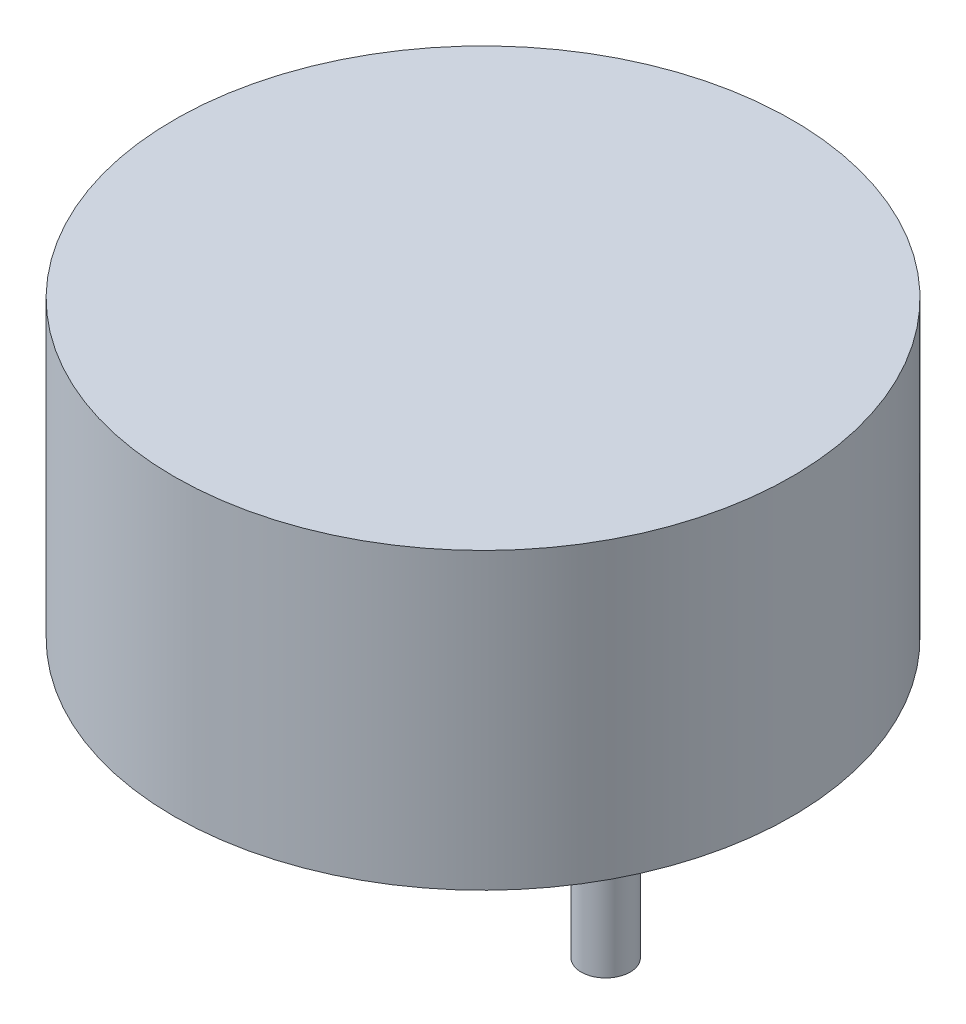
ISO-10303-21;
HEADER;
FILE_DESCRIPTION(('STEP AP214'),'2;1');
FILE_NAME('part.step','',(''),(''),'','','');
FILE_SCHEMA(('AUTOMOTIVE_DESIGN { 1 0 10303 214 1 1 1 1 }'));
ENDSEC;
DATA;
#1=APPLICATION_CONTEXT('core data for automotive mechanical design processes');
#2=APPLICATION_PROTOCOL_DEFINITION('international standard','automotive_design',2000,#1);
#3=PRODUCT_CONTEXT('',#1,'mechanical');
#4=PRODUCT('Part','Part','',(#3));
#5=PRODUCT_RELATED_PRODUCT_CATEGORY('part','',(#4));
#6=PRODUCT_DEFINITION_FORMATION('','',#4);
#7=PRODUCT_DEFINITION_CONTEXT('part definition',#1,'design');
#8=PRODUCT_DEFINITION('design','',#6,#7);
#9=PRODUCT_DEFINITION_SHAPE('','',#8);
#10=(LENGTH_UNIT() NAMED_UNIT(*) SI_UNIT(.MILLI.,.METRE.));
#11=(NAMED_UNIT(*) PLANE_ANGLE_UNIT() SI_UNIT($,.RADIAN.));
#12=(NAMED_UNIT(*) SI_UNIT($,.STERADIAN.) SOLID_ANGLE_UNIT());
#13=UNCERTAINTY_MEASURE_WITH_UNIT(LENGTH_MEASURE(1.E-05),#10,'distance_accuracy_value','');
#14=(GEOMETRIC_REPRESENTATION_CONTEXT(3) GLOBAL_UNCERTAINTY_ASSIGNED_CONTEXT((#13)) GLOBAL_UNIT_ASSIGNED_CONTEXT((#10,
#11,#12)) REPRESENTATION_CONTEXT('',''));
#15=CARTESIAN_POINT('',(0.,0.,0.));
#16=DIRECTION('',(0.,0.,1.));
#17=DIRECTION('',(1.,0.,0.));
#18=AXIS2_PLACEMENT_3D('',#15,#16,#17);
#19=CARTESIAN_POINT('',(0.,6.,0.));
#20=DIRECTION('',(0.,-1.,0.));
#21=DIRECTION('',(0.,0.,-1.));
#22=AXIS2_PLACEMENT_3D('',#19,#20,#21);
#23=CYLINDRICAL_SURFACE('',#22,6.3);
#24=CARTESIAN_POINT('',(0.,6.,0.));
#25=DIRECTION('',(0.,1.,0.));
#26=DIRECTION('',(0.,0.,1.));
#27=AXIS2_PLACEMENT_3D('',#24,#25,#26);
#28=CIRCLE('',#27,6.3);
#29=CARTESIAN_POINT('',(0.,6.,6.3));
#30=VERTEX_POINT('',#29);
#31=EDGE_CURVE('E47',#30,#30,#28,.T.);
#32=ORIENTED_EDGE('',*,*,#31,.F.);
#33=EDGE_LOOP('',(#32));
#34=FACE_BOUND('',#33,.T.);
#35=CARTESIAN_POINT('',(0.,0.,0.));
#36=DIRECTION('',(0.,1.,0.));
#37=DIRECTION('',(0.,0.,1.));
#38=AXIS2_PLACEMENT_3D('',#35,#36,#37);
#39=CIRCLE('',#38,6.3);
#40=CARTESIAN_POINT('',(0.,0.,6.3));
#41=VERTEX_POINT('',#40);
#42=EDGE_CURVE('E55',#41,#41,#39,.T.);
#43=ORIENTED_EDGE('',*,*,#42,.T.);
#44=EDGE_LOOP('',(#43));
#45=FACE_BOUND('',#44,.T.);
#46=ADVANCED_FACE('F36',(#34,#45),#23,.T.);
#47=CARTESIAN_POINT('',(0.,6.,0.));
#48=DIRECTION('',(0.,1.,0.));
#49=DIRECTION('',(0.,0.,1.));
#50=AXIS2_PLACEMENT_3D('',#47,#48,#49);
#51=PLANE('',#50);
#52=ORIENTED_EDGE('',*,*,#31,.T.);
#53=EDGE_LOOP('',(#52));
#54=FACE_BOUND('',#53,.T.);
#55=ADVANCED_FACE('F64',(#54),#51,.T.);
#56=CARTESIAN_POINT('',(0.,0.,0.));
#57=DIRECTION('',(0.,1.,0.));
#58=DIRECTION('',(0.,0.,1.));
#59=AXIS2_PLACEMENT_3D('',#56,#57,#58);
#60=PLANE('',#59);
#61=CARTESIAN_POINT('',(-2.5,0.,0.));
#62=DIRECTION('',(0.,1.,0.));
#63=DIRECTION('',(0.,0.,-1.));
#64=AXIS2_PLACEMENT_3D('',#61,#62,#63);
#65=CIRCLE('',#64,1.25);
#66=CARTESIAN_POINT('',(-2.5,0.,-1.25));
#67=VERTEX_POINT('',#66);
#68=EDGE_CURVE('E172',#67,#67,#65,.T.);
#69=ORIENTED_EDGE('',*,*,#68,.T.);
#70=EDGE_LOOP('',(#69));
#71=FACE_BOUND('',#70,.T.);
#72=CARTESIAN_POINT('',(2.5,0.,0.));
#73=DIRECTION('',(0.,1.,0.));
#74=DIRECTION('',(0.,0.,1.));
#75=AXIS2_PLACEMENT_3D('',#72,#73,#74);
#76=CIRCLE('',#75,1.25);
#77=CARTESIAN_POINT('',(2.5,0.,1.25));
#78=VERTEX_POINT('',#77);
#79=EDGE_CURVE('E39',#78,#78,#76,.F.);
#80=ORIENTED_EDGE('',*,*,#79,.F.);
#81=EDGE_LOOP('',(#80));
#82=FACE_BOUND('',#81,.T.);
#83=ORIENTED_EDGE('',*,*,#42,.F.);
#84=EDGE_LOOP('',(#83));
#85=FACE_BOUND('',#84,.T.);
#86=ADVANCED_FACE('F61',(#71,#82,#85),#60,.F.);
#87=CARTESIAN_POINT('',(2.5,-0.9,0.));
#88=DIRECTION('',(0.,1.,0.));
#89=DIRECTION('',(0.,0.,1.));
#90=AXIS2_PLACEMENT_3D('',#87,#88,#89);
#91=CYLINDRICAL_SURFACE('',#90,1.25);
#92=CARTESIAN_POINT('',(2.5,-0.9,0.));
#93=DIRECTION('',(0.,-1.,0.));
#94=DIRECTION('',(0.,0.,-1.));
#95=AXIS2_PLACEMENT_3D('',#92,#93,#94);
#96=CIRCLE('',#95,1.25);
#97=CARTESIAN_POINT('',(2.5,-0.9,-1.25));
#98=VERTEX_POINT('',#97);
#99=EDGE_CURVE('E52',#98,#98,#96,.T.);
#100=ORIENTED_EDGE('',*,*,#99,.F.);
#101=EDGE_LOOP('',(#100));
#102=FACE_BOUND('',#101,.T.);
#103=ORIENTED_EDGE('',*,*,#79,.T.);
#104=EDGE_LOOP('',(#103));
#105=FACE_BOUND('',#104,.T.);
#106=ADVANCED_FACE('F63',(#102,#105),#91,.T.);
#107=CARTESIAN_POINT('',(2.5,-0.9,0.));
#108=DIRECTION('',(0.,-1.,0.));
#109=DIRECTION('',(0.,0.,-1.));
#110=AXIS2_PLACEMENT_3D('',#107,#108,#109);
#111=PLANE('',#110);
#112=CARTESIAN_POINT('',(2.5,-0.9,0.));
#113=DIRECTION('',(0.,-1.,0.));
#114=DIRECTION('',(0.,0.,-1.));
#115=AXIS2_PLACEMENT_3D('',#112,#113,#114);
#116=CIRCLE('',#115,0.5);
#117=CARTESIAN_POINT('',(2.5,-0.9,-0.5));
#118=VERTEX_POINT('',#117);
#119=EDGE_CURVE('E10',#118,#118,#116,.T.);
#120=ORIENTED_EDGE('',*,*,#119,.F.);
#121=EDGE_LOOP('',(#120));
#122=FACE_BOUND('',#121,.T.);
#123=ORIENTED_EDGE('',*,*,#99,.T.);
#124=EDGE_LOOP('',(#123));
#125=FACE_BOUND('',#124,.T.);
#126=ADVANCED_FACE('F70',(#122,#125),#111,.T.);
#127=CARTESIAN_POINT('',(2.5,-4.4,0.));
#128=DIRECTION('',(0.,1.,0.));
#129=DIRECTION('',(0.,0.,1.));
#130=AXIS2_PLACEMENT_3D('',#127,#128,#129);
#131=CYLINDRICAL_SURFACE('',#130,0.5);
#132=CARTESIAN_POINT('',(2.5,-4.4,0.));
#133=DIRECTION('',(0.,-1.,0.));
#134=DIRECTION('',(0.,0.,-1.));
#135=AXIS2_PLACEMENT_3D('',#132,#133,#134);
#136=CIRCLE('',#135,0.5);
#137=CARTESIAN_POINT('',(2.5,-4.4,-0.5));
#138=VERTEX_POINT('',#137);
#139=EDGE_CURVE('E50',#138,#138,#136,.T.);
#140=ORIENTED_EDGE('',*,*,#139,.F.);
#141=EDGE_LOOP('',(#140));
#142=FACE_BOUND('',#141,.T.);
#143=ORIENTED_EDGE('',*,*,#119,.T.);
#144=EDGE_LOOP('',(#143));
#145=FACE_BOUND('',#144,.T.);
#146=ADVANCED_FACE('F102',(#142,#145),#131,.T.);
#147=CARTESIAN_POINT('',(2.5,-4.4,0.));
#148=DIRECTION('',(0.,-1.,0.));
#149=DIRECTION('',(0.,0.,-1.));
#150=AXIS2_PLACEMENT_3D('',#147,#148,#149);
#151=PLANE('',#150);
#152=ORIENTED_EDGE('',*,*,#139,.T.);
#153=EDGE_LOOP('',(#152));
#154=FACE_BOUND('',#153,.T.);
#155=ADVANCED_FACE('F112',(#154),#151,.T.);
#156=CARTESIAN_POINT('',(-2.5,-0.9,0.));
#157=DIRECTION('',(0.,1.,0.));
#158=DIRECTION('',(0.,0.,1.));
#159=AXIS2_PLACEMENT_3D('',#156,#157,#158);
#160=CYLINDRICAL_SURFACE('',#159,1.25);
#161=CARTESIAN_POINT('',(-2.5,-0.9,0.));
#162=DIRECTION('',(0.,1.,0.));
#163=DIRECTION('',(0.,0.,-1.));
#164=AXIS2_PLACEMENT_3D('',#161,#162,#163);
#165=CIRCLE('',#164,1.25);
#166=CARTESIAN_POINT('',(-2.5,-0.9,-1.25));
#167=VERTEX_POINT('',#166);
#168=EDGE_CURVE('E175',#167,#167,#165,.T.);
#169=ORIENTED_EDGE('',*,*,#168,.T.);
#170=EDGE_LOOP('',(#169));
#171=FACE_BOUND('',#170,.T.);
#172=ORIENTED_EDGE('',*,*,#68,.F.);
#173=EDGE_LOOP('',(#172));
#174=FACE_BOUND('',#173,.T.);
#175=ADVANCED_FACE('F121',(#171,#174),#160,.T.);
#176=CARTESIAN_POINT('',(-2.5,-0.9,0.));
#177=DIRECTION('',(0.,-1.,0.));
#178=DIRECTION('',(0.,0.,-1.));
#179=AXIS2_PLACEMENT_3D('',#176,#177,#178);
#180=PLANE('',#179);
#181=CARTESIAN_POINT('',(-2.5,-0.9,0.));
#182=DIRECTION('',(0.,1.,0.));
#183=DIRECTION('',(0.,0.,-1.));
#184=AXIS2_PLACEMENT_3D('',#181,#182,#183);
#185=CIRCLE('',#184,0.5);
#186=CARTESIAN_POINT('',(-2.5,-0.9,-0.5));
#187=VERTEX_POINT('',#186);
#188=EDGE_CURVE('E173',#187,#187,#185,.T.);
#189=ORIENTED_EDGE('',*,*,#188,.T.);
#190=EDGE_LOOP('',(#189));
#191=FACE_BOUND('',#190,.T.);
#192=ORIENTED_EDGE('',*,*,#168,.F.);
#193=EDGE_LOOP('',(#192));
#194=FACE_BOUND('',#193,.T.);
#195=ADVANCED_FACE('F135',(#191,#194),#180,.T.);
#196=CARTESIAN_POINT('',(-2.5,-4.4,0.));
#197=DIRECTION('',(0.,1.,0.));
#198=DIRECTION('',(0.,0.,1.));
#199=AXIS2_PLACEMENT_3D('',#196,#197,#198);
#200=CYLINDRICAL_SURFACE('',#199,0.5);
#201=CARTESIAN_POINT('',(-2.5,-4.4,0.));
#202=DIRECTION('',(0.,1.,0.));
#203=DIRECTION('',(0.,0.,-1.));
#204=AXIS2_PLACEMENT_3D('',#201,#202,#203);
#205=CIRCLE('',#204,0.5);
#206=CARTESIAN_POINT('',(-2.5,-4.4,-0.5));
#207=VERTEX_POINT('',#206);
#208=EDGE_CURVE('E171',#207,#207,#205,.T.);
#209=ORIENTED_EDGE('',*,*,#208,.T.);
#210=EDGE_LOOP('',(#209));
#211=FACE_BOUND('',#210,.T.);
#212=ORIENTED_EDGE('',*,*,#188,.F.);
#213=EDGE_LOOP('',(#212));
#214=FACE_BOUND('',#213,.T.);
#215=ADVANCED_FACE('F145',(#211,#214),#200,.T.);
#216=CARTESIAN_POINT('',(-2.5,-4.4,0.));
#217=DIRECTION('',(0.,-1.,0.));
#218=DIRECTION('',(0.,0.,-1.));
#219=AXIS2_PLACEMENT_3D('',#216,#217,#218);
#220=PLANE('',#219);
#221=ORIENTED_EDGE('',*,*,#208,.F.);
#222=EDGE_LOOP('',(#221));
#223=FACE_BOUND('',#222,.T.);
#224=ADVANCED_FACE('F155',(#223),#220,.T.);
#225=CLOSED_SHELL('',(#46,#55,#86,#106,#126,#146,#155,#175,#195,#215,#224));
#226=MANIFOLD_SOLID_BREP('B2',#225);
#227=ADVANCED_BREP_SHAPE_REPRESENTATION('',(#18,#226),#14);
#228=SHAPE_DEFINITION_REPRESENTATION(#9,#227);
ENDSEC;
END-ISO-10303-21;
